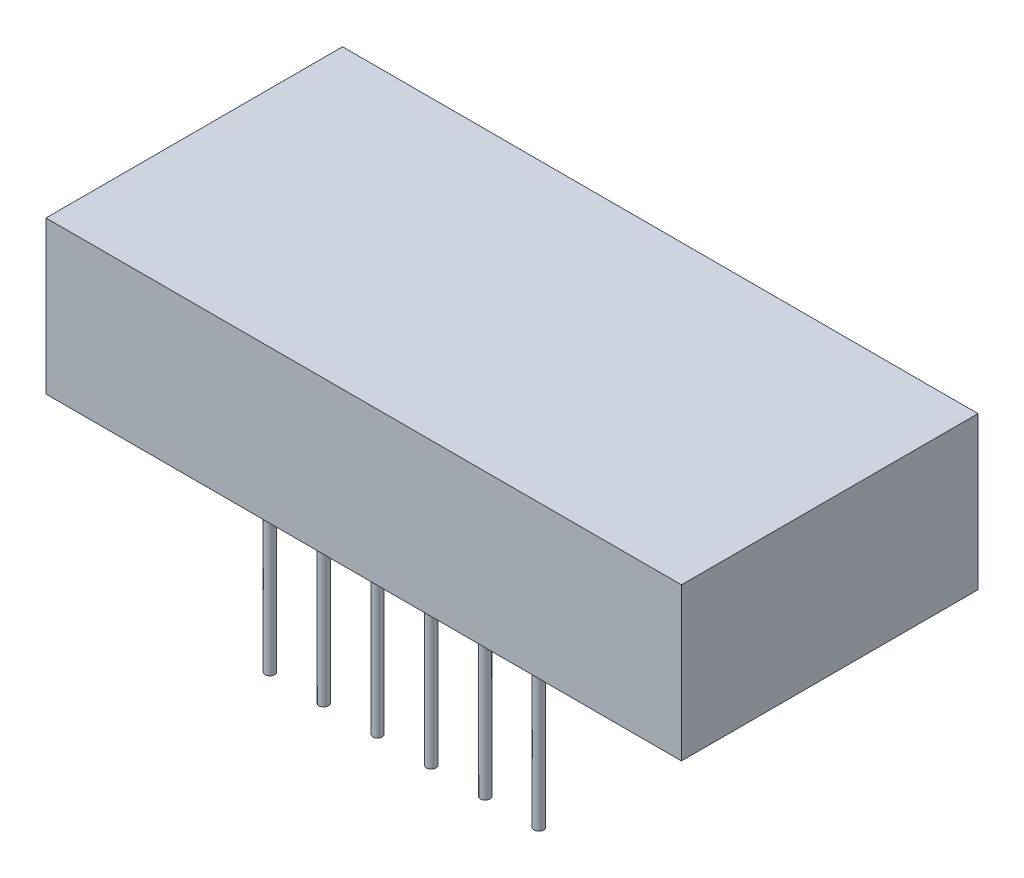
ISO-10303-21;
HEADER;
FILE_DESCRIPTION(('STEP AP214'),'2;1');
FILE_NAME('part.step','',(''),(''),'','','');
FILE_SCHEMA(('AUTOMOTIVE_DESIGN { 1 0 10303 214 1 1 1 1 }'));
ENDSEC;
DATA;
#1=APPLICATION_CONTEXT('core data for automotive mechanical design processes');
#2=APPLICATION_PROTOCOL_DEFINITION('international standard','automotive_design',2000,#1);
#3=PRODUCT_CONTEXT('',#1,'mechanical');
#4=PRODUCT('Part','Part','',(#3));
#5=PRODUCT_RELATED_PRODUCT_CATEGORY('part','',(#4));
#6=PRODUCT_DEFINITION_FORMATION('','',#4);
#7=PRODUCT_DEFINITION_CONTEXT('part definition',#1,'design');
#8=PRODUCT_DEFINITION('design','',#6,#7);
#9=PRODUCT_DEFINITION_SHAPE('','',#8);
#10=(LENGTH_UNIT() NAMED_UNIT(*) SI_UNIT(.MILLI.,.METRE.));
#11=(NAMED_UNIT(*) PLANE_ANGLE_UNIT() SI_UNIT($,.RADIAN.));
#12=(NAMED_UNIT(*) SI_UNIT($,.STERADIAN.) SOLID_ANGLE_UNIT());
#13=UNCERTAINTY_MEASURE_WITH_UNIT(LENGTH_MEASURE(1.E-05),#10,'distance_accuracy_value','');
#14=(GEOMETRIC_REPRESENTATION_CONTEXT(3) GLOBAL_UNCERTAINTY_ASSIGNED_CONTEXT((#13)) GLOBAL_UNIT_ASSIGNED_CONTEXT((#10,
#11,#12)) REPRESENTATION_CONTEXT('',''));
#15=CARTESIAN_POINT('',(0.,0.,0.));
#16=DIRECTION('',(0.,0.,1.));
#17=DIRECTION('',(1.,0.,0.));
#18=AXIS2_PLACEMENT_3D('',#15,#16,#17);
#19=CARTESIAN_POINT('',(15.,7.2,-7.));
#20=DIRECTION('',(1.,0.,0.));
#21=DIRECTION('',(0.,0.,-1.));
#22=AXIS2_PLACEMENT_3D('',#19,#20,#21);
#23=PLANE('',#22);
#24=DIRECTION('',(0.,0.,1.));
#25=VECTOR('',#24,1.);
#26=CARTESIAN_POINT('',(15.,0.,-7.));
#27=LINE('',#26,#25);
#28=CARTESIAN_POINT('',(15.,0.,-7.));
#29=VERTEX_POINT('',#28);
#30=CARTESIAN_POINT('',(15.,0.,7.));
#31=VERTEX_POINT('',#30);
#32=EDGE_CURVE('E117',#29,#31,#27,.T.);
#33=ORIENTED_EDGE('',*,*,#32,.F.);
#34=DIRECTION('',(0.,-1.,0.));
#35=VECTOR('',#34,1.);
#36=CARTESIAN_POINT('',(15.,7.2,-7.));
#37=LINE('',#36,#35);
#38=CARTESIAN_POINT('',(15.,7.2,-7.));
#39=VERTEX_POINT('',#38);
#40=EDGE_CURVE('E11',#39,#29,#37,.T.);
#41=ORIENTED_EDGE('',*,*,#40,.F.);
#42=DIRECTION('',(0.,0.,1.));
#43=VECTOR('',#42,1.);
#44=CARTESIAN_POINT('',(15.,7.2,-7.));
#45=LINE('',#44,#43);
#46=CARTESIAN_POINT('',(15.,7.2,7.));
#47=VERTEX_POINT('',#46);
#48=EDGE_CURVE('E109',#39,#47,#45,.T.);
#49=ORIENTED_EDGE('',*,*,#48,.T.);
#50=DIRECTION('',(0.,-1.,0.));
#51=VECTOR('',#50,1.);
#52=CARTESIAN_POINT('',(15.,7.2,7.));
#53=LINE('',#52,#51);
#54=EDGE_CURVE('E48',#47,#31,#53,.T.);
#55=ORIENTED_EDGE('',*,*,#54,.T.);
#56=EDGE_LOOP('',(#33,#41,#49,#55));
#57=FACE_BOUND('',#56,.T.);
#58=ADVANCED_FACE('F45',(#57),#23,.T.);
#59=CARTESIAN_POINT('',(15.,7.2,-7.));
#60=DIRECTION('',(0.,0.,1.));
#61=DIRECTION('',(1.,0.,0.));
#62=AXIS2_PLACEMENT_3D('',#59,#60,#61);
#63=PLANE('',#62);
#64=DIRECTION('',(-1.,0.,0.));
#65=VECTOR('',#64,1.);
#66=CARTESIAN_POINT('',(15.,0.,-7.));
#67=LINE('',#66,#65);
#68=CARTESIAN_POINT('',(-15.,0.,-7.));
#69=VERTEX_POINT('',#68);
#70=EDGE_CURVE('E79',#29,#69,#67,.T.);
#71=ORIENTED_EDGE('',*,*,#70,.T.);
#72=DIRECTION('',(0.,-1.,0.));
#73=VECTOR('',#72,1.);
#74=CARTESIAN_POINT('',(-15.,7.2,-7.));
#75=LINE('',#74,#73);
#76=CARTESIAN_POINT('',(-15.,7.2,-7.));
#77=VERTEX_POINT('',#76);
#78=EDGE_CURVE('E55',#77,#69,#75,.T.);
#79=ORIENTED_EDGE('',*,*,#78,.F.);
#80=DIRECTION('',(-1.,0.,0.));
#81=VECTOR('',#80,1.);
#82=CARTESIAN_POINT('',(15.,7.2,-7.));
#83=LINE('',#82,#81);
#84=EDGE_CURVE('E96',#39,#77,#83,.T.);
#85=ORIENTED_EDGE('',*,*,#84,.F.);
#86=ORIENTED_EDGE('',*,*,#40,.T.);
#87=EDGE_LOOP('',(#71,#79,#85,#86));
#88=FACE_BOUND('',#87,.T.);
#89=ADVANCED_FACE('F134',(#88),#63,.F.);
#90=CARTESIAN_POINT('',(-15.,7.2,-7.));
#91=DIRECTION('',(1.,0.,0.));
#92=DIRECTION('',(0.,0.,-1.));
#93=AXIS2_PLACEMENT_3D('',#90,#91,#92);
#94=PLANE('',#93);
#95=DIRECTION('',(0.,0.,1.));
#96=VECTOR('',#95,1.);
#97=CARTESIAN_POINT('',(-15.,0.,-7.));
#98=LINE('',#97,#96);
#99=CARTESIAN_POINT('',(-15.,0.,7.));
#100=VERTEX_POINT('',#99);
#101=EDGE_CURVE('E104',#69,#100,#98,.T.);
#102=ORIENTED_EDGE('',*,*,#101,.T.);
#103=DIRECTION('',(0.,-1.,0.));
#104=VECTOR('',#103,1.);
#105=CARTESIAN_POINT('',(-15.,7.2,7.));
#106=LINE('',#105,#104);
#107=CARTESIAN_POINT('',(-15.,7.2,7.));
#108=VERTEX_POINT('',#107);
#109=EDGE_CURVE('E101',#108,#100,#106,.T.);
#110=ORIENTED_EDGE('',*,*,#109,.F.);
#111=DIRECTION('',(0.,0.,1.));
#112=VECTOR('',#111,1.);
#113=CARTESIAN_POINT('',(-15.,7.2,-7.));
#114=LINE('',#113,#112);
#115=EDGE_CURVE('E91',#77,#108,#114,.T.);
#116=ORIENTED_EDGE('',*,*,#115,.F.);
#117=ORIENTED_EDGE('',*,*,#78,.T.);
#118=EDGE_LOOP('',(#102,#110,#116,#117));
#119=FACE_BOUND('',#118,.T.);
#120=ADVANCED_FACE('F102',(#119),#94,.F.);
#121=CARTESIAN_POINT('',(15.,7.2,7.));
#122=DIRECTION('',(0.,0.,1.));
#123=DIRECTION('',(1.,0.,0.));
#124=AXIS2_PLACEMENT_3D('',#121,#122,#123);
#125=PLANE('',#124);
#126=DIRECTION('',(-1.,0.,0.));
#127=VECTOR('',#126,1.);
#128=CARTESIAN_POINT('',(15.,0.,7.));
#129=LINE('',#128,#127);
#130=EDGE_CURVE('E121',#31,#100,#129,.T.);
#131=ORIENTED_EDGE('',*,*,#130,.F.);
#132=ORIENTED_EDGE('',*,*,#54,.F.);
#133=DIRECTION('',(-1.,0.,0.));
#134=VECTOR('',#133,1.);
#135=CARTESIAN_POINT('',(15.,7.2,7.));
#136=LINE('',#135,#134);
#137=EDGE_CURVE('E95',#47,#108,#136,.T.);
#138=ORIENTED_EDGE('',*,*,#137,.T.);
#139=ORIENTED_EDGE('',*,*,#109,.T.);
#140=EDGE_LOOP('',(#131,#132,#138,#139));
#141=FACE_BOUND('',#140,.T.);
#142=ADVANCED_FACE('F107',(#141),#125,.T.);
#143=CARTESIAN_POINT('',(0.,7.2,0.));
#144=DIRECTION('',(0.,-1.,0.));
#145=DIRECTION('',(0.,0.,-1.));
#146=AXIS2_PLACEMENT_3D('',#143,#144,#145);
#147=PLANE('',#146);
#148=ORIENTED_EDGE('',*,*,#48,.F.);
#149=ORIENTED_EDGE('',*,*,#84,.T.);
#150=ORIENTED_EDGE('',*,*,#115,.T.);
#151=ORIENTED_EDGE('',*,*,#137,.F.);
#152=EDGE_LOOP('',(#148,#149,#150,#151));
#153=FACE_BOUND('',#152,.T.);
#154=ADVANCED_FACE('F94',(#153),#147,.F.);
#155=CARTESIAN_POINT('',(0.,0.,0.));
#156=DIRECTION('',(0.,-1.,0.));
#157=DIRECTION('',(0.,0.,-1.));
#158=AXIS2_PLACEMENT_3D('',#155,#156,#157);
#159=PLANE('',#158);
#160=CARTESIAN_POINT('',(-6.35000000000004,0.,5.08));
#161=DIRECTION('',(0.,-1.,0.));
#162=DIRECTION('',(0.,0.,-1.));
#163=AXIS2_PLACEMENT_3D('',#160,#161,#162);
#164=CIRCLE('',#163,0.224999999999999);
#165=CARTESIAN_POINT('',(-6.35000000000004,0.,4.855));
#166=VERTEX_POINT('',#165);
#167=EDGE_CURVE('E258',#166,#166,#164,.T.);
#168=ORIENTED_EDGE('',*,*,#167,.F.);
#169=EDGE_LOOP('',(#168));
#170=FACE_BOUND('',#169,.T.);
#171=CARTESIAN_POINT('',(6.34999999999996,0.,5.08));
#172=DIRECTION('',(0.,-1.,0.));
#173=DIRECTION('',(0.,0.,-1.));
#174=AXIS2_PLACEMENT_3D('',#171,#172,#173);
#175=CIRCLE('',#174,0.224999999999999);
#176=CARTESIAN_POINT('',(6.34999999999996,0.,4.855));
#177=VERTEX_POINT('',#176);
#178=EDGE_CURVE('E265',#177,#177,#175,.T.);
#179=ORIENTED_EDGE('',*,*,#178,.F.);
#180=EDGE_LOOP('',(#179));
#181=FACE_BOUND('',#180,.T.);
#182=CARTESIAN_POINT('',(3.80999999999996,0.,5.08));
#183=DIRECTION('',(0.,-1.,0.));
#184=DIRECTION('',(0.,0.,-1.));
#185=AXIS2_PLACEMENT_3D('',#182,#183,#184);
#186=CIRCLE('',#185,0.224999999999999);
#187=CARTESIAN_POINT('',(3.80999999999996,0.,4.855));
#188=VERTEX_POINT('',#187);
#189=EDGE_CURVE('E273',#188,#188,#186,.T.);
#190=ORIENTED_EDGE('',*,*,#189,.F.);
#191=EDGE_LOOP('',(#190));
#192=FACE_BOUND('',#191,.T.);
#193=CARTESIAN_POINT('',(1.26999999999996,0.,5.08));
#194=DIRECTION('',(0.,-1.,0.));
#195=DIRECTION('',(0.,0.,-1.));
#196=AXIS2_PLACEMENT_3D('',#193,#194,#195);
#197=CIRCLE('',#196,0.224999999999999);
#198=CARTESIAN_POINT('',(1.26999999999996,0.,4.855));
#199=VERTEX_POINT('',#198);
#200=EDGE_CURVE('E281',#199,#199,#197,.T.);
#201=ORIENTED_EDGE('',*,*,#200,.F.);
#202=EDGE_LOOP('',(#201));
#203=FACE_BOUND('',#202,.T.);
#204=CARTESIAN_POINT('',(-1.27000000000004,0.,5.08));
#205=DIRECTION('',(0.,-1.,0.));
#206=DIRECTION('',(0.,0.,-1.));
#207=AXIS2_PLACEMENT_3D('',#204,#205,#206);
#208=CIRCLE('',#207,0.224999999999999);
#209=CARTESIAN_POINT('',(-1.27000000000004,0.,4.855));
#210=VERTEX_POINT('',#209);
#211=EDGE_CURVE('E289',#210,#210,#208,.T.);
#212=ORIENTED_EDGE('',*,*,#211,.F.);
#213=EDGE_LOOP('',(#212));
#214=FACE_BOUND('',#213,.T.);
#215=CARTESIAN_POINT('',(-3.81000000000004,0.,5.08));
#216=DIRECTION('',(0.,-1.,0.));
#217=DIRECTION('',(0.,0.,-1.));
#218=AXIS2_PLACEMENT_3D('',#215,#216,#217);
#219=CIRCLE('',#218,0.224999999999999);
#220=CARTESIAN_POINT('',(-3.81000000000004,0.,4.855));
#221=VERTEX_POINT('',#220);
#222=EDGE_CURVE('E297',#221,#221,#219,.T.);
#223=ORIENTED_EDGE('',*,*,#222,.F.);
#224=EDGE_LOOP('',(#223));
#225=FACE_BOUND('',#224,.T.);
#226=CARTESIAN_POINT('',(6.35,0.,-5.08));
#227=DIRECTION('',(0.,-1.,0.));
#228=DIRECTION('',(0.,0.,-1.));
#229=AXIS2_PLACEMENT_3D('',#226,#227,#228);
#230=CIRCLE('',#229,0.224999999999999);
#231=CARTESIAN_POINT('',(6.35,0.,-5.305));
#232=VERTEX_POINT('',#231);
#233=EDGE_CURVE('E305',#232,#232,#230,.T.);
#234=ORIENTED_EDGE('',*,*,#233,.F.);
#235=EDGE_LOOP('',(#234));
#236=FACE_BOUND('',#235,.T.);
#237=CARTESIAN_POINT('',(3.81,0.,-5.08));
#238=DIRECTION('',(0.,-1.,0.));
#239=DIRECTION('',(0.,0.,-1.));
#240=AXIS2_PLACEMENT_3D('',#237,#238,#239);
#241=CIRCLE('',#240,0.224999999999999);
#242=CARTESIAN_POINT('',(3.81,0.,-5.305));
#243=VERTEX_POINT('',#242);
#244=EDGE_CURVE('E313',#243,#243,#241,.T.);
#245=ORIENTED_EDGE('',*,*,#244,.F.);
#246=EDGE_LOOP('',(#245));
#247=FACE_BOUND('',#246,.T.);
#248=CARTESIAN_POINT('',(1.27,0.,-5.08));
#249=DIRECTION('',(0.,-1.,0.));
#250=DIRECTION('',(0.,0.,-1.));
#251=AXIS2_PLACEMENT_3D('',#248,#249,#250);
#252=CIRCLE('',#251,0.224999999999999);
#253=CARTESIAN_POINT('',(1.27,0.,-5.305));
#254=VERTEX_POINT('',#253);
#255=EDGE_CURVE('E321',#254,#254,#252,.T.);
#256=ORIENTED_EDGE('',*,*,#255,.F.);
#257=EDGE_LOOP('',(#256));
#258=FACE_BOUND('',#257,.T.);
#259=CARTESIAN_POINT('',(-1.27,0.,-5.08));
#260=DIRECTION('',(0.,-1.,0.));
#261=DIRECTION('',(0.,0.,-1.));
#262=AXIS2_PLACEMENT_3D('',#259,#260,#261);
#263=CIRCLE('',#262,0.224999999999999);
#264=CARTESIAN_POINT('',(-1.27,0.,-5.305));
#265=VERTEX_POINT('',#264);
#266=EDGE_CURVE('E329',#265,#265,#263,.T.);
#267=ORIENTED_EDGE('',*,*,#266,.F.);
#268=EDGE_LOOP('',(#267));
#269=FACE_BOUND('',#268,.T.);
#270=CARTESIAN_POINT('',(-3.81,0.,-5.08));
#271=DIRECTION('',(0.,-1.,0.));
#272=DIRECTION('',(0.,0.,-1.));
#273=AXIS2_PLACEMENT_3D('',#270,#271,#272);
#274=CIRCLE('',#273,0.224999999999999);
#275=CARTESIAN_POINT('',(-3.81,0.,-5.305));
#276=VERTEX_POINT('',#275);
#277=EDGE_CURVE('E337',#276,#276,#274,.T.);
#278=ORIENTED_EDGE('',*,*,#277,.F.);
#279=EDGE_LOOP('',(#278));
#280=FACE_BOUND('',#279,.T.);
#281=CARTESIAN_POINT('',(-6.35,0.,-5.08));
#282=DIRECTION('',(0.,-1.,0.));
#283=DIRECTION('',(0.,0.,-1.));
#284=AXIS2_PLACEMENT_3D('',#281,#282,#283);
#285=CIRCLE('',#284,0.224999999999999);
#286=CARTESIAN_POINT('',(-6.35,0.,-5.305));
#287=VERTEX_POINT('',#286);
#288=EDGE_CURVE('E341',#287,#287,#285,.T.);
#289=ORIENTED_EDGE('',*,*,#288,.F.);
#290=EDGE_LOOP('',(#289));
#291=FACE_BOUND('',#290,.T.);
#292=ORIENTED_EDGE('',*,*,#32,.T.);
#293=ORIENTED_EDGE('',*,*,#130,.T.);
#294=ORIENTED_EDGE('',*,*,#101,.F.);
#295=ORIENTED_EDGE('',*,*,#70,.F.);
#296=EDGE_LOOP('',(#292,#293,#294,#295));
#297=FACE_BOUND('',#296,.T.);
#298=ADVANCED_FACE('F131',(#170,#181,#192,#203,#214,#225,#236,#247,#258,#269,#280,#291,#297),
#159,.T.);
#299=CARTESIAN_POINT('',(-6.35,-8.,-5.08));
#300=DIRECTION('',(0.,1.,0.));
#301=DIRECTION('',(0.,0.,1.));
#302=AXIS2_PLACEMENT_3D('',#299,#300,#301);
#303=CYLINDRICAL_SURFACE('',#302,0.224999999999999);
#304=CARTESIAN_POINT('',(-6.35,-8.,-5.08));
#305=DIRECTION('',(0.,-1.,0.));
#306=DIRECTION('',(0.,0.,-1.));
#307=AXIS2_PLACEMENT_3D('',#304,#305,#306);
#308=CIRCLE('',#307,0.224999999999999);
#309=CARTESIAN_POINT('',(-6.35,-8.,-5.305));
#310=VERTEX_POINT('',#309);
#311=EDGE_CURVE('E122',#310,#310,#308,.T.);
#312=ORIENTED_EDGE('',*,*,#311,.F.);
#313=EDGE_LOOP('',(#312));
#314=FACE_BOUND('',#313,.T.);
#315=ORIENTED_EDGE('',*,*,#288,.T.);
#316=EDGE_LOOP('',(#315));
#317=FACE_BOUND('',#316,.T.);
#318=ADVANCED_FACE('F153',(#314,#317),#303,.T.);
#319=CARTESIAN_POINT('',(-6.35,-8.,-5.08));
#320=DIRECTION('',(0.,-1.,0.));
#321=DIRECTION('',(0.,0.,-1.));
#322=AXIS2_PLACEMENT_3D('',#319,#320,#321);
#323=PLANE('',#322);
#324=ORIENTED_EDGE('',*,*,#311,.T.);
#325=EDGE_LOOP('',(#324));
#326=FACE_BOUND('',#325,.T.);
#327=ADVANCED_FACE('F158',(#326),#323,.T.);
#328=CARTESIAN_POINT('',(-3.81,-8.,-5.08));
#329=DIRECTION('',(0.,1.,0.));
#330=DIRECTION('',(0.,0.,1.));
#331=AXIS2_PLACEMENT_3D('',#328,#329,#330);
#332=CYLINDRICAL_SURFACE('',#331,0.224999999999999);
#333=CARTESIAN_POINT('',(-3.81,-8.,-5.08));
#334=DIRECTION('',(0.,-1.,0.));
#335=DIRECTION('',(0.,0.,-1.));
#336=AXIS2_PLACEMENT_3D('',#333,#334,#335);
#337=CIRCLE('',#336,0.224999999999999);
#338=CARTESIAN_POINT('',(-3.81,-8.,-5.305));
#339=VERTEX_POINT('',#338);
#340=EDGE_CURVE('E333',#339,#339,#337,.T.);
#341=ORIENTED_EDGE('',*,*,#340,.F.);
#342=EDGE_LOOP('',(#341));
#343=FACE_BOUND('',#342,.T.);
#344=ORIENTED_EDGE('',*,*,#277,.T.);
#345=EDGE_LOOP('',(#344));
#346=FACE_BOUND('',#345,.T.);
#347=ADVANCED_FACE('F162',(#343,#346),#332,.T.);
#348=CARTESIAN_POINT('',(-3.81,-8.,-5.08));
#349=DIRECTION('',(0.,-1.,0.));
#350=DIRECTION('',(0.,0.,-1.));
#351=AXIS2_PLACEMENT_3D('',#348,#349,#350);
#352=PLANE('',#351);
#353=ORIENTED_EDGE('',*,*,#340,.T.);
#354=EDGE_LOOP('',(#353));
#355=FACE_BOUND('',#354,.T.);
#356=ADVANCED_FACE('F164',(#355),#352,.T.);
#357=CARTESIAN_POINT('',(-1.27,-8.,-5.08));
#358=DIRECTION('',(0.,1.,0.));
#359=DIRECTION('',(0.,0.,1.));
#360=AXIS2_PLACEMENT_3D('',#357,#358,#359);
#361=CYLINDRICAL_SURFACE('',#360,0.224999999999999);
#362=CARTESIAN_POINT('',(-1.27,-8.,-5.08));
#363=DIRECTION('',(0.,-1.,0.));
#364=DIRECTION('',(0.,0.,-1.));
#365=AXIS2_PLACEMENT_3D('',#362,#363,#364);
#366=CIRCLE('',#365,0.224999999999999);
#367=CARTESIAN_POINT('',(-1.27,-8.,-5.305));
#368=VERTEX_POINT('',#367);
#369=EDGE_CURVE('E325',#368,#368,#366,.T.);
#370=ORIENTED_EDGE('',*,*,#369,.F.);
#371=EDGE_LOOP('',(#370));
#372=FACE_BOUND('',#371,.T.);
#373=ORIENTED_EDGE('',*,*,#266,.T.);
#374=EDGE_LOOP('',(#373));
#375=FACE_BOUND('',#374,.T.);
#376=ADVANCED_FACE('F167',(#372,#375),#361,.T.);
#377=CARTESIAN_POINT('',(-1.27,-8.,-5.08));
#378=DIRECTION('',(0.,-1.,0.));
#379=DIRECTION('',(0.,0.,-1.));
#380=AXIS2_PLACEMENT_3D('',#377,#378,#379);
#381=PLANE('',#380);
#382=ORIENTED_EDGE('',*,*,#369,.T.);
#383=EDGE_LOOP('',(#382));
#384=FACE_BOUND('',#383,.T.);
#385=ADVANCED_FACE('F172',(#384),#381,.T.);
#386=CARTESIAN_POINT('',(1.27,-8.,-5.08));
#387=DIRECTION('',(0.,1.,0.));
#388=DIRECTION('',(0.,0.,1.));
#389=AXIS2_PLACEMENT_3D('',#386,#387,#388);
#390=CYLINDRICAL_SURFACE('',#389,0.224999999999999);
#391=CARTESIAN_POINT('',(1.27,-8.,-5.08));
#392=DIRECTION('',(0.,-1.,0.));
#393=DIRECTION('',(0.,0.,-1.));
#394=AXIS2_PLACEMENT_3D('',#391,#392,#393);
#395=CIRCLE('',#394,0.224999999999999);
#396=CARTESIAN_POINT('',(1.27,-8.,-5.305));
#397=VERTEX_POINT('',#396);
#398=EDGE_CURVE('E317',#397,#397,#395,.T.);
#399=ORIENTED_EDGE('',*,*,#398,.F.);
#400=EDGE_LOOP('',(#399));
#401=FACE_BOUND('',#400,.T.);
#402=ORIENTED_EDGE('',*,*,#255,.T.);
#403=EDGE_LOOP('',(#402));
#404=FACE_BOUND('',#403,.T.);
#405=ADVANCED_FACE('F175',(#401,#404),#390,.T.);
#406=CARTESIAN_POINT('',(1.27,-8.,-5.08));
#407=DIRECTION('',(0.,-1.,0.));
#408=DIRECTION('',(0.,0.,-1.));
#409=AXIS2_PLACEMENT_3D('',#406,#407,#408);
#410=PLANE('',#409);
#411=ORIENTED_EDGE('',*,*,#398,.T.);
#412=EDGE_LOOP('',(#411));
#413=FACE_BOUND('',#412,.T.);
#414=ADVANCED_FACE('F180',(#413),#410,.T.);
#415=CARTESIAN_POINT('',(3.81,-8.,-5.08));
#416=DIRECTION('',(0.,1.,0.));
#417=DIRECTION('',(0.,0.,1.));
#418=AXIS2_PLACEMENT_3D('',#415,#416,#417);
#419=CYLINDRICAL_SURFACE('',#418,0.224999999999999);
#420=CARTESIAN_POINT('',(3.81,-8.,-5.08));
#421=DIRECTION('',(0.,-1.,0.));
#422=DIRECTION('',(0.,0.,-1.));
#423=AXIS2_PLACEMENT_3D('',#420,#421,#422);
#424=CIRCLE('',#423,0.224999999999999);
#425=CARTESIAN_POINT('',(3.81,-8.,-5.305));
#426=VERTEX_POINT('',#425);
#427=EDGE_CURVE('E309',#426,#426,#424,.T.);
#428=ORIENTED_EDGE('',*,*,#427,.F.);
#429=EDGE_LOOP('',(#428));
#430=FACE_BOUND('',#429,.T.);
#431=ORIENTED_EDGE('',*,*,#244,.T.);
#432=EDGE_LOOP('',(#431));
#433=FACE_BOUND('',#432,.T.);
#434=ADVANCED_FACE('F183',(#430,#433),#419,.T.);
#435=CARTESIAN_POINT('',(3.81,-8.,-5.08));
#436=DIRECTION('',(0.,-1.,0.));
#437=DIRECTION('',(0.,0.,-1.));
#438=AXIS2_PLACEMENT_3D('',#435,#436,#437);
#439=PLANE('',#438);
#440=ORIENTED_EDGE('',*,*,#427,.T.);
#441=EDGE_LOOP('',(#440));
#442=FACE_BOUND('',#441,.T.);
#443=ADVANCED_FACE('F188',(#442),#439,.T.);
#444=CARTESIAN_POINT('',(6.35,-8.,-5.08));
#445=DIRECTION('',(0.,1.,0.));
#446=DIRECTION('',(0.,0.,1.));
#447=AXIS2_PLACEMENT_3D('',#444,#445,#446);
#448=CYLINDRICAL_SURFACE('',#447,0.224999999999999);
#449=CARTESIAN_POINT('',(6.35,-8.,-5.08));
#450=DIRECTION('',(0.,-1.,0.));
#451=DIRECTION('',(0.,0.,-1.));
#452=AXIS2_PLACEMENT_3D('',#449,#450,#451);
#453=CIRCLE('',#452,0.224999999999999);
#454=CARTESIAN_POINT('',(6.35,-8.,-5.305));
#455=VERTEX_POINT('',#454);
#456=EDGE_CURVE('E301',#455,#455,#453,.T.);
#457=ORIENTED_EDGE('',*,*,#456,.F.);
#458=EDGE_LOOP('',(#457));
#459=FACE_BOUND('',#458,.T.);
#460=ORIENTED_EDGE('',*,*,#233,.T.);
#461=EDGE_LOOP('',(#460));
#462=FACE_BOUND('',#461,.T.);
#463=ADVANCED_FACE('F191',(#459,#462),#448,.T.);
#464=CARTESIAN_POINT('',(6.35,-8.,-5.08));
#465=DIRECTION('',(0.,-1.,0.));
#466=DIRECTION('',(0.,0.,-1.));
#467=AXIS2_PLACEMENT_3D('',#464,#465,#466);
#468=PLANE('',#467);
#469=ORIENTED_EDGE('',*,*,#456,.T.);
#470=EDGE_LOOP('',(#469));
#471=FACE_BOUND('',#470,.T.);
#472=ADVANCED_FACE('F196',(#471),#468,.T.);
#473=CARTESIAN_POINT('',(-3.81000000000004,-8.,5.08));
#474=DIRECTION('',(0.,1.,0.));
#475=DIRECTION('',(0.,0.,1.));
#476=AXIS2_PLACEMENT_3D('',#473,#474,#475);
#477=CYLINDRICAL_SURFACE('',#476,0.224999999999999);
#478=CARTESIAN_POINT('',(-3.81000000000004,-8.,5.08));
#479=DIRECTION('',(0.,-1.,0.));
#480=DIRECTION('',(0.,0.,-1.));
#481=AXIS2_PLACEMENT_3D('',#478,#479,#480);
#482=CIRCLE('',#481,0.224999999999999);
#483=CARTESIAN_POINT('',(-3.81000000000004,-8.,4.855));
#484=VERTEX_POINT('',#483);
#485=EDGE_CURVE('E293',#484,#484,#482,.T.);
#486=ORIENTED_EDGE('',*,*,#485,.F.);
#487=EDGE_LOOP('',(#486));
#488=FACE_BOUND('',#487,.T.);
#489=ORIENTED_EDGE('',*,*,#222,.T.);
#490=EDGE_LOOP('',(#489));
#491=FACE_BOUND('',#490,.T.);
#492=ADVANCED_FACE('F199',(#488,#491),#477,.T.);
#493=CARTESIAN_POINT('',(-3.81000000000004,-8.,5.08));
#494=DIRECTION('',(0.,-1.,0.));
#495=DIRECTION('',(0.,0.,-1.));
#496=AXIS2_PLACEMENT_3D('',#493,#494,#495);
#497=PLANE('',#496);
#498=ORIENTED_EDGE('',*,*,#485,.T.);
#499=EDGE_LOOP('',(#498));
#500=FACE_BOUND('',#499,.T.);
#501=ADVANCED_FACE('F204',(#500),#497,.T.);
#502=CARTESIAN_POINT('',(-1.27000000000004,-8.,5.08));
#503=DIRECTION('',(0.,1.,0.));
#504=DIRECTION('',(0.,0.,1.));
#505=AXIS2_PLACEMENT_3D('',#502,#503,#504);
#506=CYLINDRICAL_SURFACE('',#505,0.224999999999999);
#507=CARTESIAN_POINT('',(-1.27000000000004,-8.,5.08));
#508=DIRECTION('',(0.,-1.,0.));
#509=DIRECTION('',(0.,0.,-1.));
#510=AXIS2_PLACEMENT_3D('',#507,#508,#509);
#511=CIRCLE('',#510,0.224999999999999);
#512=CARTESIAN_POINT('',(-1.27000000000004,-8.,4.855));
#513=VERTEX_POINT('',#512);
#514=EDGE_CURVE('E285',#513,#513,#511,.T.);
#515=ORIENTED_EDGE('',*,*,#514,.F.);
#516=EDGE_LOOP('',(#515));
#517=FACE_BOUND('',#516,.T.);
#518=ORIENTED_EDGE('',*,*,#211,.T.);
#519=EDGE_LOOP('',(#518));
#520=FACE_BOUND('',#519,.T.);
#521=ADVANCED_FACE('F207',(#517,#520),#506,.T.);
#522=CARTESIAN_POINT('',(-1.27000000000004,-8.,5.08));
#523=DIRECTION('',(0.,-1.,0.));
#524=DIRECTION('',(0.,0.,-1.));
#525=AXIS2_PLACEMENT_3D('',#522,#523,#524);
#526=PLANE('',#525);
#527=ORIENTED_EDGE('',*,*,#514,.T.);
#528=EDGE_LOOP('',(#527));
#529=FACE_BOUND('',#528,.T.);
#530=ADVANCED_FACE('F212',(#529),#526,.T.);
#531=CARTESIAN_POINT('',(1.26999999999996,-8.,5.08));
#532=DIRECTION('',(0.,1.,0.));
#533=DIRECTION('',(0.,0.,1.));
#534=AXIS2_PLACEMENT_3D('',#531,#532,#533);
#535=CYLINDRICAL_SURFACE('',#534,0.224999999999999);
#536=CARTESIAN_POINT('',(1.26999999999996,-8.,5.08));
#537=DIRECTION('',(0.,-1.,0.));
#538=DIRECTION('',(0.,0.,-1.));
#539=AXIS2_PLACEMENT_3D('',#536,#537,#538);
#540=CIRCLE('',#539,0.224999999999999);
#541=CARTESIAN_POINT('',(1.26999999999996,-8.,4.855));
#542=VERTEX_POINT('',#541);
#543=EDGE_CURVE('E277',#542,#542,#540,.T.);
#544=ORIENTED_EDGE('',*,*,#543,.F.);
#545=EDGE_LOOP('',(#544));
#546=FACE_BOUND('',#545,.T.);
#547=ORIENTED_EDGE('',*,*,#200,.T.);
#548=EDGE_LOOP('',(#547));
#549=FACE_BOUND('',#548,.T.);
#550=ADVANCED_FACE('F215',(#546,#549),#535,.T.);
#551=CARTESIAN_POINT('',(1.26999999999996,-8.,5.08));
#552=DIRECTION('',(0.,-1.,0.));
#553=DIRECTION('',(0.,0.,-1.));
#554=AXIS2_PLACEMENT_3D('',#551,#552,#553);
#555=PLANE('',#554);
#556=ORIENTED_EDGE('',*,*,#543,.T.);
#557=EDGE_LOOP('',(#556));
#558=FACE_BOUND('',#557,.T.);
#559=ADVANCED_FACE('F220',(#558),#555,.T.);
#560=CARTESIAN_POINT('',(3.80999999999996,-8.,5.08));
#561=DIRECTION('',(0.,1.,0.));
#562=DIRECTION('',(0.,0.,1.));
#563=AXIS2_PLACEMENT_3D('',#560,#561,#562);
#564=CYLINDRICAL_SURFACE('',#563,0.224999999999999);
#565=CARTESIAN_POINT('',(3.80999999999996,-8.,5.08));
#566=DIRECTION('',(0.,-1.,0.));
#567=DIRECTION('',(0.,0.,-1.));
#568=AXIS2_PLACEMENT_3D('',#565,#566,#567);
#569=CIRCLE('',#568,0.224999999999999);
#570=CARTESIAN_POINT('',(3.80999999999996,-8.,4.855));
#571=VERTEX_POINT('',#570);
#572=EDGE_CURVE('E271',#571,#571,#569,.T.);
#573=ORIENTED_EDGE('',*,*,#572,.F.);
#574=EDGE_LOOP('',(#573));
#575=FACE_BOUND('',#574,.T.);
#576=ORIENTED_EDGE('',*,*,#189,.T.);
#577=EDGE_LOOP('',(#576));
#578=FACE_BOUND('',#577,.T.);
#579=ADVANCED_FACE('F223',(#575,#578),#564,.T.);
#580=CARTESIAN_POINT('',(3.80999999999996,-8.,5.08));
#581=DIRECTION('',(0.,-1.,0.));
#582=DIRECTION('',(0.,0.,-1.));
#583=AXIS2_PLACEMENT_3D('',#580,#581,#582);
#584=PLANE('',#583);
#585=ORIENTED_EDGE('',*,*,#572,.T.);
#586=EDGE_LOOP('',(#585));
#587=FACE_BOUND('',#586,.T.);
#588=ADVANCED_FACE('F228',(#587),#584,.T.);
#589=CARTESIAN_POINT('',(6.34999999999996,-8.,5.08));
#590=DIRECTION('',(0.,1.,0.));
#591=DIRECTION('',(0.,0.,1.));
#592=AXIS2_PLACEMENT_3D('',#589,#590,#591);
#593=CYLINDRICAL_SURFACE('',#592,0.224999999999999);
#594=CARTESIAN_POINT('',(6.34999999999996,-8.,5.08));
#595=DIRECTION('',(0.,-1.,0.));
#596=DIRECTION('',(0.,0.,-1.));
#597=AXIS2_PLACEMENT_3D('',#594,#595,#596);
#598=CIRCLE('',#597,0.224999999999999);
#599=CARTESIAN_POINT('',(6.34999999999996,-8.,4.855));
#600=VERTEX_POINT('',#599);
#601=EDGE_CURVE('E260',#600,#600,#598,.T.);
#602=ORIENTED_EDGE('',*,*,#601,.F.);
#603=EDGE_LOOP('',(#602));
#604=FACE_BOUND('',#603,.T.);
#605=ORIENTED_EDGE('',*,*,#178,.T.);
#606=EDGE_LOOP('',(#605));
#607=FACE_BOUND('',#606,.T.);
#608=ADVANCED_FACE('F231',(#604,#607),#593,.T.);
#609=CARTESIAN_POINT('',(6.34999999999996,-8.,5.08));
#610=DIRECTION('',(0.,-1.,0.));
#611=DIRECTION('',(0.,0.,-1.));
#612=AXIS2_PLACEMENT_3D('',#609,#610,#611);
#613=PLANE('',#612);
#614=ORIENTED_EDGE('',*,*,#601,.T.);
#615=EDGE_LOOP('',(#614));
#616=FACE_BOUND('',#615,.T.);
#617=ADVANCED_FACE('F236',(#616),#613,.T.);
#618=CARTESIAN_POINT('',(-6.35000000000004,-8.,5.08));
#619=DIRECTION('',(0.,1.,0.));
#620=DIRECTION('',(0.,0.,1.));
#621=AXIS2_PLACEMENT_3D('',#618,#619,#620);
#622=CYLINDRICAL_SURFACE('',#621,0.224999999999999);
#623=CARTESIAN_POINT('',(-6.35000000000004,-8.,5.08));
#624=DIRECTION('',(0.,-1.,0.));
#625=DIRECTION('',(0.,0.,-1.));
#626=AXIS2_PLACEMENT_3D('',#623,#624,#625);
#627=CIRCLE('',#626,0.224999999999999);
#628=CARTESIAN_POINT('',(-6.35000000000004,-8.,4.855));
#629=VERTEX_POINT('',#628);
#630=EDGE_CURVE('E255',#629,#629,#627,.T.);
#631=ORIENTED_EDGE('',*,*,#630,.F.);
#632=EDGE_LOOP('',(#631));
#633=FACE_BOUND('',#632,.T.);
#634=ORIENTED_EDGE('',*,*,#167,.T.);
#635=EDGE_LOOP('',(#634));
#636=FACE_BOUND('',#635,.T.);
#637=ADVANCED_FACE('F239',(#633,#636),#622,.T.);
#638=CARTESIAN_POINT('',(-6.35000000000004,-8.,5.08));
#639=DIRECTION('',(0.,-1.,0.));
#640=DIRECTION('',(0.,0.,-1.));
#641=AXIS2_PLACEMENT_3D('',#638,#639,#640);
#642=PLANE('',#641);
#643=ORIENTED_EDGE('',*,*,#630,.T.);
#644=EDGE_LOOP('',(#643));
#645=FACE_BOUND('',#644,.T.);
#646=ADVANCED_FACE('F244',(#645),#642,.T.);
#647=CLOSED_SHELL('',(#58,#89,#120,#142,#154,#298,#318,#327,#347,#356,#376,#385,#405,#414,#434,
#443,#463,#472,#492,#501,#521,#530,#550,#559,#579,#588,#608,#617,#637,#646));
#648=MANIFOLD_SOLID_BREP('B2',#647);
#649=ADVANCED_BREP_SHAPE_REPRESENTATION('',(#18,#648),#14);
#650=SHAPE_DEFINITION_REPRESENTATION(#9,#649);
ENDSEC;
END-ISO-10303-21;
